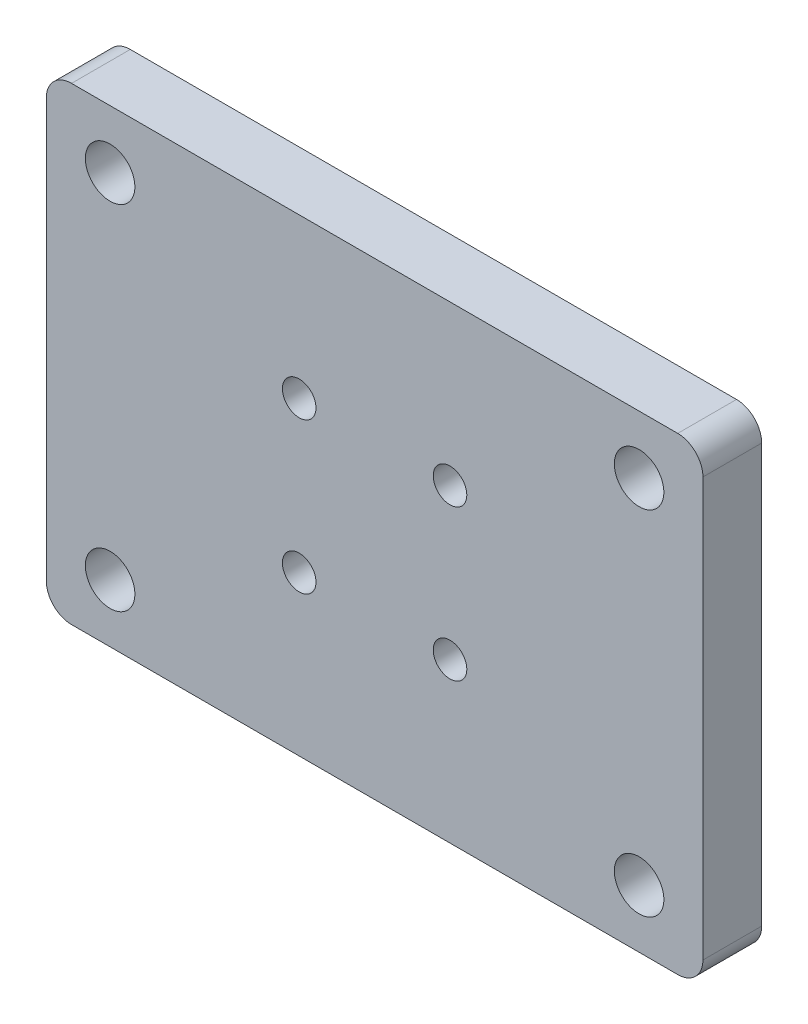
ISO-10303-21;
HEADER;
FILE_DESCRIPTION(('STEP AP214'),'2;1');
FILE_NAME('part.step','',(''),(''),'','','');
FILE_SCHEMA(('AUTOMOTIVE_DESIGN { 1 0 10303 214 1 1 1 1 }'));
ENDSEC;
DATA;
#1=APPLICATION_CONTEXT('core data for automotive mechanical design processes');
#2=APPLICATION_PROTOCOL_DEFINITION('international standard','automotive_design',2000,#1);
#3=PRODUCT_CONTEXT('',#1,'mechanical');
#4=PRODUCT('Part','Part','',(#3));
#5=PRODUCT_RELATED_PRODUCT_CATEGORY('part','',(#4));
#6=PRODUCT_DEFINITION_FORMATION('','',#4);
#7=PRODUCT_DEFINITION_CONTEXT('part definition',#1,'design');
#8=PRODUCT_DEFINITION('design','',#6,#7);
#9=PRODUCT_DEFINITION_SHAPE('','',#8);
#10=(LENGTH_UNIT() NAMED_UNIT(*) SI_UNIT(.MILLI.,.METRE.));
#11=(NAMED_UNIT(*) PLANE_ANGLE_UNIT() SI_UNIT($,.RADIAN.));
#12=(NAMED_UNIT(*) SI_UNIT($,.STERADIAN.) SOLID_ANGLE_UNIT());
#13=UNCERTAINTY_MEASURE_WITH_UNIT(LENGTH_MEASURE(1.E-05),#10,'distance_accuracy_value','');
#14=(GEOMETRIC_REPRESENTATION_CONTEXT(3) GLOBAL_UNCERTAINTY_ASSIGNED_CONTEXT((#13)) GLOBAL_UNIT_ASSIGNED_CONTEXT((#10,
#11,#12)) REPRESENTATION_CONTEXT('',''));
#15=CARTESIAN_POINT('',(0.,0.,0.));
#16=DIRECTION('',(0.,0.,1.));
#17=DIRECTION('',(1.,0.,0.));
#18=AXIS2_PLACEMENT_3D('',#15,#16,#17);
#19=CARTESIAN_POINT('',(8.98025612106915,-8.98025612106936,7.));
#20=DIRECTION('',(0.,0.,1.));
#21=DIRECTION('',(1.,0.,0.));
#22=AXIS2_PLACEMENT_3D('',#19,#20,#21);
#23=CYLINDRICAL_SURFACE('',#22,2.);
#24=CARTESIAN_POINT('',(8.98025612106915,-8.98025612106936,7.));
#25=DIRECTION('',(0.,0.,1.));
#26=DIRECTION('',(1.,0.,0.));
#27=AXIS2_PLACEMENT_3D('',#24,#25,#26);
#28=CIRCLE('',#27,2.);
#29=CARTESIAN_POINT('',(10.9802561210692,-8.98025612106936,7.));
#30=VERTEX_POINT('',#29);
#31=EDGE_CURVE('E197',#30,#30,#28,.T.);
#32=ORIENTED_EDGE('',*,*,#31,.T.);
#33=EDGE_LOOP('',(#32));
#34=FACE_BOUND('',#33,.T.);
#35=CARTESIAN_POINT('',(8.98025612106915,-8.98025612106936,2.));
#36=DIRECTION('',(0.,0.,-1.));
#37=DIRECTION('',(-1.,0.,0.));
#38=AXIS2_PLACEMENT_3D('',#35,#36,#37);
#39=CIRCLE('',#38,2.);
#40=CARTESIAN_POINT('',(6.98025612106915,-8.98025612106936,2.));
#41=VERTEX_POINT('',#40);
#42=EDGE_CURVE('E222',#41,#41,#39,.F.);
#43=ORIENTED_EDGE('',*,*,#42,.F.);
#44=EDGE_LOOP('',(#43));
#45=FACE_BOUND('',#44,.T.);
#46=ADVANCED_FACE('F39',(#34,#45),#23,.F.);
#47=CARTESIAN_POINT('',(-8.98025612106936,-8.98025612106915,7.));
#48=DIRECTION('',(0.,0.,1.));
#49=DIRECTION('',(1.,0.,0.));
#50=AXIS2_PLACEMENT_3D('',#47,#48,#49);
#51=CYLINDRICAL_SURFACE('',#50,2.);
#52=CARTESIAN_POINT('',(-8.98025612106936,-8.98025612106915,7.));
#53=DIRECTION('',(0.,0.,1.));
#54=DIRECTION('',(1.,0.,0.));
#55=AXIS2_PLACEMENT_3D('',#52,#53,#54);
#56=CIRCLE('',#55,2.);
#57=CARTESIAN_POINT('',(-6.98025612106936,-8.98025612106915,7.));
#58=VERTEX_POINT('',#57);
#59=EDGE_CURVE('E213',#58,#58,#56,.T.);
#60=ORIENTED_EDGE('',*,*,#59,.T.);
#61=EDGE_LOOP('',(#60));
#62=FACE_BOUND('',#61,.T.);
#63=CARTESIAN_POINT('',(-8.98025612106936,-8.98025612106915,2.));
#64=DIRECTION('',(0.,0.,-1.));
#65=DIRECTION('',(-1.,0.,0.));
#66=AXIS2_PLACEMENT_3D('',#63,#64,#65);
#67=CIRCLE('',#66,2.);
#68=CARTESIAN_POINT('',(-10.9802561210694,-8.98025612106915,2.));
#69=VERTEX_POINT('',#68);
#70=EDGE_CURVE('E225',#69,#69,#67,.F.);
#71=ORIENTED_EDGE('',*,*,#70,.F.);
#72=EDGE_LOOP('',(#71));
#73=FACE_BOUND('',#72,.T.);
#74=ADVANCED_FACE('F255',(#62,#73),#51,.F.);
#75=CARTESIAN_POINT('',(-8.98025612106915,8.98025612106936,7.));
#76=DIRECTION('',(0.,0.,1.));
#77=DIRECTION('',(1.,0.,0.));
#78=AXIS2_PLACEMENT_3D('',#75,#76,#77);
#79=CYLINDRICAL_SURFACE('',#78,2.);
#80=CARTESIAN_POINT('',(-8.98025612106915,8.98025612106936,7.));
#81=DIRECTION('',(0.,0.,1.));
#82=DIRECTION('',(1.,0.,0.));
#83=AXIS2_PLACEMENT_3D('',#80,#81,#82);
#84=CIRCLE('',#83,2.);
#85=CARTESIAN_POINT('',(-6.98025612106915,8.98025612106936,7.));
#86=VERTEX_POINT('',#85);
#87=EDGE_CURVE('E216',#86,#86,#84,.T.);
#88=ORIENTED_EDGE('',*,*,#87,.T.);
#89=EDGE_LOOP('',(#88));
#90=FACE_BOUND('',#89,.T.);
#91=CARTESIAN_POINT('',(-8.98025612106915,8.98025612106936,2.));
#92=DIRECTION('',(0.,0.,-1.));
#93=DIRECTION('',(-1.,0.,0.));
#94=AXIS2_PLACEMENT_3D('',#91,#92,#93);
#95=CIRCLE('',#94,2.);
#96=CARTESIAN_POINT('',(-10.9802561210692,8.98025612106936,2.));
#97=VERTEX_POINT('',#96);
#98=EDGE_CURVE('E228',#97,#97,#95,.F.);
#99=ORIENTED_EDGE('',*,*,#98,.F.);
#100=EDGE_LOOP('',(#99));
#101=FACE_BOUND('',#100,.T.);
#102=ADVANCED_FACE('F246',(#90,#101),#79,.F.);
#103=CARTESIAN_POINT('',(8.98025612106936,8.98025612106915,7.));
#104=DIRECTION('',(0.,0.,1.));
#105=DIRECTION('',(1.,0.,0.));
#106=AXIS2_PLACEMENT_3D('',#103,#104,#105);
#107=CYLINDRICAL_SURFACE('',#106,2.);
#108=CARTESIAN_POINT('',(8.98025612106936,8.98025612106915,7.));
#109=DIRECTION('',(0.,0.,1.));
#110=DIRECTION('',(1.,0.,0.));
#111=AXIS2_PLACEMENT_3D('',#108,#109,#110);
#112=CIRCLE('',#111,2.);
#113=CARTESIAN_POINT('',(10.9802561210694,8.98025612106915,7.));
#114=VERTEX_POINT('',#113);
#115=EDGE_CURVE('E219',#114,#114,#112,.T.);
#116=ORIENTED_EDGE('',*,*,#115,.T.);
#117=EDGE_LOOP('',(#116));
#118=FACE_BOUND('',#117,.T.);
#119=CARTESIAN_POINT('',(8.98025612106936,8.98025612106915,2.));
#120=DIRECTION('',(0.,0.,-1.));
#121=DIRECTION('',(-1.,0.,0.));
#122=AXIS2_PLACEMENT_3D('',#119,#120,#121);
#123=CIRCLE('',#122,2.);
#124=CARTESIAN_POINT('',(6.98025612106936,8.98025612106915,2.));
#125=VERTEX_POINT('',#124);
#126=EDGE_CURVE('E43',#125,#125,#123,.F.);
#127=ORIENTED_EDGE('',*,*,#126,.F.);
#128=EDGE_LOOP('',(#127));
#129=FACE_BOUND('',#128,.T.);
#130=ADVANCED_FACE('F244',(#118,#129),#107,.F.);
#131=CARTESIAN_POINT('',(-36.1,-24.91,0.));
#132=DIRECTION('',(0.,0.,-1.));
#133=DIRECTION('',(-1.,0.,0.));
#134=AXIS2_PLACEMENT_3D('',#131,#132,#133);
#135=PLANE('',#134);
#136=CARTESIAN_POINT('',(0.,0.,0.));
#137=DIRECTION('',(0.,0.,-1.));
#138=DIRECTION('',(-1.,0.,0.));
#139=AXIS2_PLACEMENT_3D('',#136,#137,#138);
#140=CIRCLE('',#139,20.5);
#141=CARTESIAN_POINT('',(-20.5,0.,0.));
#142=VERTEX_POINT('',#141);
#143=EDGE_CURVE('E231',#142,#142,#140,.T.);
#144=ORIENTED_EDGE('',*,*,#143,.F.);
#145=EDGE_LOOP('',(#144));
#146=FACE_BOUND('',#145,.T.);
#147=CARTESIAN_POINT('',(-36.1,-24.91,0.));
#148=DIRECTION('',(0.,0.,1.));
#149=DIRECTION('',(-1.,0.,0.));
#150=AXIS2_PLACEMENT_3D('',#147,#148,#149);
#151=CIRCLE('',#150,3.);
#152=CARTESIAN_POINT('',(-39.1,-24.91,0.));
#153=VERTEX_POINT('',#152);
#154=CARTESIAN_POINT('',(-36.1,-27.91,0.));
#155=VERTEX_POINT('',#154);
#156=EDGE_CURVE('E137',#153,#155,#151,.T.);
#157=ORIENTED_EDGE('',*,*,#156,.F.);
#158=DIRECTION('',(0.,-1.,0.));
#159=VECTOR('',#158,1.);
#160=CARTESIAN_POINT('',(-39.1,24.91,0.));
#161=LINE('',#160,#159);
#162=CARTESIAN_POINT('',(-39.1,24.91,0.));
#163=VERTEX_POINT('',#162);
#164=EDGE_CURVE('E92',#163,#153,#161,.T.);
#165=ORIENTED_EDGE('',*,*,#164,.F.);
#166=CARTESIAN_POINT('',(-36.1,24.91,0.));
#167=DIRECTION('',(0.,0.,1.));
#168=DIRECTION('',(1.,0.,0.));
#169=AXIS2_PLACEMENT_3D('',#166,#167,#168);
#170=CIRCLE('',#169,3.);
#171=CARTESIAN_POINT('',(-36.1,27.91,0.));
#172=VERTEX_POINT('',#171);
#173=EDGE_CURVE('E86',#172,#163,#170,.T.);
#174=ORIENTED_EDGE('',*,*,#173,.F.);
#175=DIRECTION('',(-1.,0.,0.));
#176=VECTOR('',#175,1.);
#177=CARTESIAN_POINT('',(-36.1,27.91,0.));
#178=LINE('',#177,#176);
#179=CARTESIAN_POINT('',(36.1,27.91,0.));
#180=VERTEX_POINT('',#179);
#181=EDGE_CURVE('E127',#180,#172,#178,.T.);
#182=ORIENTED_EDGE('',*,*,#181,.F.);
#183=CARTESIAN_POINT('',(36.1,24.91,0.));
#184=DIRECTION('',(0.,0.,1.));
#185=DIRECTION('',(1.,0.,0.));
#186=AXIS2_PLACEMENT_3D('',#183,#184,#185);
#187=CIRCLE('',#186,3.);
#188=CARTESIAN_POINT('',(39.1,24.91,0.));
#189=VERTEX_POINT('',#188);
#190=EDGE_CURVE('E147',#189,#180,#187,.T.);
#191=ORIENTED_EDGE('',*,*,#190,.F.);
#192=DIRECTION('',(0.,1.,0.));
#193=VECTOR('',#192,1.);
#194=CARTESIAN_POINT('',(39.1,24.91,0.));
#195=LINE('',#194,#193);
#196=CARTESIAN_POINT('',(39.1,-24.91,0.));
#197=VERTEX_POINT('',#196);
#198=EDGE_CURVE('E145',#197,#189,#195,.T.);
#199=ORIENTED_EDGE('',*,*,#198,.F.);
#200=CARTESIAN_POINT('',(36.1,-24.91,0.));
#201=DIRECTION('',(0.,0.,1.));
#202=DIRECTION('',(-1.,0.,0.));
#203=AXIS2_PLACEMENT_3D('',#200,#201,#202);
#204=CIRCLE('',#203,3.);
#205=CARTESIAN_POINT('',(36.1,-27.91,0.));
#206=VERTEX_POINT('',#205);
#207=EDGE_CURVE('E143',#206,#197,#204,.T.);
#208=ORIENTED_EDGE('',*,*,#207,.F.);
#209=DIRECTION('',(1.,0.,0.));
#210=VECTOR('',#209,1.);
#211=CARTESIAN_POINT('',(-36.1,-27.91,0.));
#212=LINE('',#211,#210);
#213=EDGE_CURVE('E140',#155,#206,#212,.T.);
#214=ORIENTED_EDGE('',*,*,#213,.F.);
#215=EDGE_LOOP('',(#157,#165,#174,#182,#191,#199,#208,#214));
#216=FACE_BOUND('',#215,.T.);
#217=CARTESIAN_POINT('',(31.5,21.,0.));
#218=DIRECTION('',(0.,0.,1.));
#219=DIRECTION('',(1.,0.,0.));
#220=AXIS2_PLACEMENT_3D('',#217,#218,#219);
#221=CIRCLE('',#220,2.95);
#222=CARTESIAN_POINT('',(34.45,21.,0.));
#223=VERTEX_POINT('',#222);
#224=EDGE_CURVE('E187',#223,#223,#221,.T.);
#225=ORIENTED_EDGE('',*,*,#224,.T.);
#226=EDGE_LOOP('',(#225));
#227=FACE_BOUND('',#226,.T.);
#228=CARTESIAN_POINT('',(-31.5,21.,0.));
#229=DIRECTION('',(0.,0.,1.));
#230=DIRECTION('',(1.,0.,0.));
#231=AXIS2_PLACEMENT_3D('',#228,#229,#230);
#232=CIRCLE('',#231,2.95);
#233=CARTESIAN_POINT('',(-28.55,21.,0.));
#234=VERTEX_POINT('',#233);
#235=EDGE_CURVE('E206',#234,#234,#232,.T.);
#236=ORIENTED_EDGE('',*,*,#235,.T.);
#237=EDGE_LOOP('',(#236));
#238=FACE_BOUND('',#237,.T.);
#239=CARTESIAN_POINT('',(-31.5,-21.,0.));
#240=DIRECTION('',(0.,0.,1.));
#241=DIRECTION('',(1.,0.,0.));
#242=AXIS2_PLACEMENT_3D('',#239,#240,#241);
#243=CIRCLE('',#242,2.95);
#244=CARTESIAN_POINT('',(-28.55,-21.,0.));
#245=VERTEX_POINT('',#244);
#246=EDGE_CURVE('E200',#245,#245,#243,.T.);
#247=ORIENTED_EDGE('',*,*,#246,.T.);
#248=EDGE_LOOP('',(#247));
#249=FACE_BOUND('',#248,.T.);
#250=CARTESIAN_POINT('',(31.5,-21.,0.));
#251=DIRECTION('',(0.,0.,1.));
#252=DIRECTION('',(1.,0.,0.));
#253=AXIS2_PLACEMENT_3D('',#250,#251,#252);
#254=CIRCLE('',#253,2.95);
#255=CARTESIAN_POINT('',(34.45,-21.,0.));
#256=VERTEX_POINT('',#255);
#257=EDGE_CURVE('E193',#256,#256,#254,.T.);
#258=ORIENTED_EDGE('',*,*,#257,.T.);
#259=EDGE_LOOP('',(#258));
#260=FACE_BOUND('',#259,.T.);
#261=ADVANCED_FACE('F172',(#146,#216,#227,#238,#249,#260),#135,.T.);
#262=CARTESIAN_POINT('',(-36.1,-24.91,7.));
#263=DIRECTION('',(0.,0.,-1.));
#264=DIRECTION('',(-1.,0.,0.));
#265=AXIS2_PLACEMENT_3D('',#262,#263,#264);
#266=CYLINDRICAL_SURFACE('',#265,3.);
#267=ORIENTED_EDGE('',*,*,#156,.T.);
#268=DIRECTION('',(0.,0.,-1.));
#269=VECTOR('',#268,1.);
#270=CARTESIAN_POINT('',(-36.1,-27.91,7.));
#271=LINE('',#270,#269);
#272=CARTESIAN_POINT('',(-36.1,-27.91,7.));
#273=VERTEX_POINT('',#272);
#274=EDGE_CURVE('E11',#273,#155,#271,.T.);
#275=ORIENTED_EDGE('',*,*,#274,.F.);
#276=CARTESIAN_POINT('',(-36.1,-24.91,7.));
#277=DIRECTION('',(0.,0.,1.));
#278=DIRECTION('',(-1.,0.,0.));
#279=AXIS2_PLACEMENT_3D('',#276,#277,#278);
#280=CIRCLE('',#279,3.);
#281=CARTESIAN_POINT('',(-39.1,-24.91,7.));
#282=VERTEX_POINT('',#281);
#283=EDGE_CURVE('E152',#282,#273,#280,.T.);
#284=ORIENTED_EDGE('',*,*,#283,.F.);
#285=DIRECTION('',(0.,0.,-1.));
#286=VECTOR('',#285,1.);
#287=CARTESIAN_POINT('',(-39.1,-24.91,7.));
#288=LINE('',#287,#286);
#289=EDGE_CURVE('E133',#282,#153,#288,.T.);
#290=ORIENTED_EDGE('',*,*,#289,.T.);
#291=EDGE_LOOP('',(#267,#275,#284,#290));
#292=FACE_BOUND('',#291,.T.);
#293=ADVANCED_FACE('F41',(#292),#266,.T.);
#294=CARTESIAN_POINT('',(-36.1,-27.91,7.));
#295=DIRECTION('',(0.,1.,0.));
#296=DIRECTION('',(0.,0.,1.));
#297=AXIS2_PLACEMENT_3D('',#294,#295,#296);
#298=PLANE('',#297);
#299=ORIENTED_EDGE('',*,*,#213,.T.);
#300=DIRECTION('',(0.,0.,-1.));
#301=VECTOR('',#300,1.);
#302=CARTESIAN_POINT('',(36.1,-27.91,7.));
#303=LINE('',#302,#301);
#304=CARTESIAN_POINT('',(36.1,-27.91,7.));
#305=VERTEX_POINT('',#304);
#306=EDGE_CURVE('E49',#305,#206,#303,.T.);
#307=ORIENTED_EDGE('',*,*,#306,.F.);
#308=DIRECTION('',(1.,0.,0.));
#309=VECTOR('',#308,1.);
#310=CARTESIAN_POINT('',(-36.1,-27.91,7.));
#311=LINE('',#310,#309);
#312=EDGE_CURVE('E100',#273,#305,#311,.T.);
#313=ORIENTED_EDGE('',*,*,#312,.F.);
#314=ORIENTED_EDGE('',*,*,#274,.T.);
#315=EDGE_LOOP('',(#299,#307,#313,#314));
#316=FACE_BOUND('',#315,.T.);
#317=ADVANCED_FACE('F300',(#316),#298,.F.);
#318=CARTESIAN_POINT('',(36.1,-24.91,7.));
#319=DIRECTION('',(0.,0.,-1.));
#320=DIRECTION('',(-1.,0.,0.));
#321=AXIS2_PLACEMENT_3D('',#318,#319,#320);
#322=CYLINDRICAL_SURFACE('',#321,3.);
#323=ORIENTED_EDGE('',*,*,#207,.T.);
#324=DIRECTION('',(0.,0.,-1.));
#325=VECTOR('',#324,1.);
#326=CARTESIAN_POINT('',(39.1,-24.91,7.));
#327=LINE('',#326,#325);
#328=CARTESIAN_POINT('',(39.1,-24.91,7.));
#329=VERTEX_POINT('',#328);
#330=EDGE_CURVE('E159',#329,#197,#327,.T.);
#331=ORIENTED_EDGE('',*,*,#330,.F.);
#332=CARTESIAN_POINT('',(36.1,-24.91,7.));
#333=DIRECTION('',(0.,0.,1.));
#334=DIRECTION('',(-1.,0.,0.));
#335=AXIS2_PLACEMENT_3D('',#332,#333,#334);
#336=CIRCLE('',#335,3.);
#337=EDGE_CURVE('E168',#305,#329,#336,.T.);
#338=ORIENTED_EDGE('',*,*,#337,.F.);
#339=ORIENTED_EDGE('',*,*,#306,.T.);
#340=EDGE_LOOP('',(#323,#331,#338,#339));
#341=FACE_BOUND('',#340,.T.);
#342=ADVANCED_FACE('F166',(#341),#322,.T.);
#343=CARTESIAN_POINT('',(39.1,24.91,7.));
#344=DIRECTION('',(-1.,0.,0.));
#345=DIRECTION('',(0.,0.,1.));
#346=AXIS2_PLACEMENT_3D('',#343,#344,#345);
#347=PLANE('',#346);
#348=ORIENTED_EDGE('',*,*,#198,.T.);
#349=DIRECTION('',(0.,0.,-1.));
#350=VECTOR('',#349,1.);
#351=CARTESIAN_POINT('',(39.1,24.91,7.));
#352=LINE('',#351,#350);
#353=CARTESIAN_POINT('',(39.1,24.91,7.));
#354=VERTEX_POINT('',#353);
#355=EDGE_CURVE('E156',#354,#189,#352,.T.);
#356=ORIENTED_EDGE('',*,*,#355,.F.);
#357=DIRECTION('',(0.,1.,0.));
#358=VECTOR('',#357,1.);
#359=CARTESIAN_POINT('',(39.1,24.91,7.));
#360=LINE('',#359,#358);
#361=EDGE_CURVE('E181',#329,#354,#360,.T.);
#362=ORIENTED_EDGE('',*,*,#361,.F.);
#363=ORIENTED_EDGE('',*,*,#330,.T.);
#364=EDGE_LOOP('',(#348,#356,#362,#363));
#365=FACE_BOUND('',#364,.T.);
#366=ADVANCED_FACE('F177',(#365),#347,.F.);
#367=CARTESIAN_POINT('',(36.1,24.91,7.));
#368=DIRECTION('',(0.,0.,-1.));
#369=DIRECTION('',(-1.,0.,0.));
#370=AXIS2_PLACEMENT_3D('',#367,#368,#369);
#371=CYLINDRICAL_SURFACE('',#370,3.);
#372=ORIENTED_EDGE('',*,*,#190,.T.);
#373=DIRECTION('',(0.,0.,-1.));
#374=VECTOR('',#373,1.);
#375=CARTESIAN_POINT('',(36.1,27.91,7.));
#376=LINE('',#375,#374);
#377=CARTESIAN_POINT('',(36.1,27.91,7.));
#378=VERTEX_POINT('',#377);
#379=EDGE_CURVE('E128',#378,#180,#376,.T.);
#380=ORIENTED_EDGE('',*,*,#379,.F.);
#381=CARTESIAN_POINT('',(36.1,24.91,7.));
#382=DIRECTION('',(0.,0.,1.));
#383=DIRECTION('',(1.,0.,0.));
#384=AXIS2_PLACEMENT_3D('',#381,#382,#383);
#385=CIRCLE('',#384,3.);
#386=EDGE_CURVE('E119',#354,#378,#385,.T.);
#387=ORIENTED_EDGE('',*,*,#386,.F.);
#388=ORIENTED_EDGE('',*,*,#355,.T.);
#389=EDGE_LOOP('',(#372,#380,#387,#388));
#390=FACE_BOUND('',#389,.T.);
#391=ADVANCED_FACE('F180',(#390),#371,.T.);
#392=CARTESIAN_POINT('',(-36.1,27.91,7.));
#393=DIRECTION('',(0.,-1.,0.));
#394=DIRECTION('',(1.,0.,0.));
#395=AXIS2_PLACEMENT_3D('',#392,#393,#394);
#396=PLANE('',#395);
#397=ORIENTED_EDGE('',*,*,#181,.T.);
#398=DIRECTION('',(0.,0.,-1.));
#399=VECTOR('',#398,1.);
#400=CARTESIAN_POINT('',(-36.1,27.91,7.));
#401=LINE('',#400,#399);
#402=CARTESIAN_POINT('',(-36.1,27.91,7.));
#403=VERTEX_POINT('',#402);
#404=EDGE_CURVE('E124',#403,#172,#401,.T.);
#405=ORIENTED_EDGE('',*,*,#404,.F.);
#406=DIRECTION('',(-1.,0.,0.));
#407=VECTOR('',#406,1.);
#408=CARTESIAN_POINT('',(-36.1,27.91,7.));
#409=LINE('',#408,#407);
#410=EDGE_CURVE('E113',#378,#403,#409,.T.);
#411=ORIENTED_EDGE('',*,*,#410,.F.);
#412=ORIENTED_EDGE('',*,*,#379,.T.);
#413=EDGE_LOOP('',(#397,#405,#411,#412));
#414=FACE_BOUND('',#413,.T.);
#415=ADVANCED_FACE('F125',(#414),#396,.F.);
#416=CARTESIAN_POINT('',(-36.1,24.91,7.));
#417=DIRECTION('',(0.,0.,-1.));
#418=DIRECTION('',(-1.,0.,0.));
#419=AXIS2_PLACEMENT_3D('',#416,#417,#418);
#420=CYLINDRICAL_SURFACE('',#419,3.);
#421=ORIENTED_EDGE('',*,*,#173,.T.);
#422=DIRECTION('',(0.,0.,-1.));
#423=VECTOR('',#422,1.);
#424=CARTESIAN_POINT('',(-39.1,24.91,7.));
#425=LINE('',#424,#423);
#426=CARTESIAN_POINT('',(-39.1,24.91,7.));
#427=VERTEX_POINT('',#426);
#428=EDGE_CURVE('E129',#427,#163,#425,.T.);
#429=ORIENTED_EDGE('',*,*,#428,.F.);
#430=CARTESIAN_POINT('',(-36.1,24.91,7.));
#431=DIRECTION('',(0.,0.,1.));
#432=DIRECTION('',(1.,0.,0.));
#433=AXIS2_PLACEMENT_3D('',#430,#431,#432);
#434=CIRCLE('',#433,3.);
#435=EDGE_CURVE('E117',#403,#427,#434,.T.);
#436=ORIENTED_EDGE('',*,*,#435,.F.);
#437=ORIENTED_EDGE('',*,*,#404,.T.);
#438=EDGE_LOOP('',(#421,#429,#436,#437));
#439=FACE_BOUND('',#438,.T.);
#440=ADVANCED_FACE('F131',(#439),#420,.T.);
#441=CARTESIAN_POINT('',(-39.1,24.91,7.));
#442=DIRECTION('',(1.,0.,0.));
#443=DIRECTION('',(0.,0.,-1.));
#444=AXIS2_PLACEMENT_3D('',#441,#442,#443);
#445=PLANE('',#444);
#446=ORIENTED_EDGE('',*,*,#164,.T.);
#447=ORIENTED_EDGE('',*,*,#289,.F.);
#448=DIRECTION('',(0.,-1.,0.));
#449=VECTOR('',#448,1.);
#450=CARTESIAN_POINT('',(-39.1,24.91,7.));
#451=LINE('',#450,#449);
#452=EDGE_CURVE('E57',#427,#282,#451,.T.);
#453=ORIENTED_EDGE('',*,*,#452,.F.);
#454=ORIENTED_EDGE('',*,*,#428,.T.);
#455=EDGE_LOOP('',(#446,#447,#453,#454));
#456=FACE_BOUND('',#455,.T.);
#457=ADVANCED_FACE('F286',(#456),#445,.F.);
#458=CARTESIAN_POINT('',(-36.1,-24.91,7.));
#459=DIRECTION('',(0.,0.,-1.));
#460=DIRECTION('',(-1.,0.,0.));
#461=AXIS2_PLACEMENT_3D('',#458,#459,#460);
#462=PLANE('',#461);
#463=ORIENTED_EDGE('',*,*,#115,.F.);
#464=EDGE_LOOP('',(#463));
#465=FACE_BOUND('',#464,.T.);
#466=ORIENTED_EDGE('',*,*,#87,.F.);
#467=EDGE_LOOP('',(#466));
#468=FACE_BOUND('',#467,.T.);
#469=ORIENTED_EDGE('',*,*,#59,.F.);
#470=EDGE_LOOP('',(#469));
#471=FACE_BOUND('',#470,.T.);
#472=ORIENTED_EDGE('',*,*,#31,.F.);
#473=EDGE_LOOP('',(#472));
#474=FACE_BOUND('',#473,.T.);
#475=CARTESIAN_POINT('',(31.5,-21.,7.));
#476=DIRECTION('',(0.,0.,1.));
#477=DIRECTION('',(1.,0.,0.));
#478=AXIS2_PLACEMENT_3D('',#475,#476,#477);
#479=CIRCLE('',#478,2.95);
#480=CARTESIAN_POINT('',(34.45,-21.,7.));
#481=VERTEX_POINT('',#480);
#482=EDGE_CURVE('E196',#481,#481,#479,.T.);
#483=ORIENTED_EDGE('',*,*,#482,.F.);
#484=EDGE_LOOP('',(#483));
#485=FACE_BOUND('',#484,.T.);
#486=CARTESIAN_POINT('',(-31.5,-21.,7.));
#487=DIRECTION('',(0.,0.,1.));
#488=DIRECTION('',(1.,0.,0.));
#489=AXIS2_PLACEMENT_3D('',#486,#487,#488);
#490=CIRCLE('',#489,2.95);
#491=CARTESIAN_POINT('',(-28.55,-21.,7.));
#492=VERTEX_POINT('',#491);
#493=EDGE_CURVE('E203',#492,#492,#490,.T.);
#494=ORIENTED_EDGE('',*,*,#493,.F.);
#495=EDGE_LOOP('',(#494));
#496=FACE_BOUND('',#495,.T.);
#497=CARTESIAN_POINT('',(-31.5,21.,7.));
#498=DIRECTION('',(0.,0.,1.));
#499=DIRECTION('',(1.,0.,0.));
#500=AXIS2_PLACEMENT_3D('',#497,#498,#499);
#501=CIRCLE('',#500,2.95);
#502=CARTESIAN_POINT('',(-28.55,21.,7.));
#503=VERTEX_POINT('',#502);
#504=EDGE_CURVE('E190',#503,#503,#501,.T.);
#505=ORIENTED_EDGE('',*,*,#504,.F.);
#506=EDGE_LOOP('',(#505));
#507=FACE_BOUND('',#506,.T.);
#508=CARTESIAN_POINT('',(31.5,21.,7.));
#509=DIRECTION('',(0.,0.,1.));
#510=DIRECTION('',(1.,0.,0.));
#511=AXIS2_PLACEMENT_3D('',#508,#509,#510);
#512=CIRCLE('',#511,2.95);
#513=CARTESIAN_POINT('',(34.45,21.,7.));
#514=VERTEX_POINT('',#513);
#515=EDGE_CURVE('E141',#514,#514,#512,.T.);
#516=ORIENTED_EDGE('',*,*,#515,.F.);
#517=EDGE_LOOP('',(#516));
#518=FACE_BOUND('',#517,.T.);
#519=ORIENTED_EDGE('',*,*,#283,.T.);
#520=ORIENTED_EDGE('',*,*,#312,.T.);
#521=ORIENTED_EDGE('',*,*,#337,.T.);
#522=ORIENTED_EDGE('',*,*,#361,.T.);
#523=ORIENTED_EDGE('',*,*,#386,.T.);
#524=ORIENTED_EDGE('',*,*,#410,.T.);
#525=ORIENTED_EDGE('',*,*,#435,.T.);
#526=ORIENTED_EDGE('',*,*,#452,.T.);
#527=EDGE_LOOP('',(#519,#520,#521,#522,#523,#524,#525,#526));
#528=FACE_BOUND('',#527,.T.);
#529=ADVANCED_FACE('F115',(#465,#468,#471,#474,#485,#496,#507,#518,#528),#462,.F.);
#530=CARTESIAN_POINT('',(31.5,21.,7.));
#531=DIRECTION('',(0.,0.,-1.));
#532=DIRECTION('',(-1.,0.,0.));
#533=AXIS2_PLACEMENT_3D('',#530,#531,#532);
#534=CYLINDRICAL_SURFACE('',#533,2.95);
#535=ORIENTED_EDGE('',*,*,#515,.T.);
#536=EDGE_LOOP('',(#535));
#537=FACE_BOUND('',#536,.T.);
#538=ORIENTED_EDGE('',*,*,#224,.F.);
#539=EDGE_LOOP('',(#538));
#540=FACE_BOUND('',#539,.T.);
#541=ADVANCED_FACE('F274',(#537,#540),#534,.F.);
#542=CARTESIAN_POINT('',(-31.5,21.,7.));
#543=DIRECTION('',(0.,0.,-1.));
#544=DIRECTION('',(-1.,0.,0.));
#545=AXIS2_PLACEMENT_3D('',#542,#543,#544);
#546=CYLINDRICAL_SURFACE('',#545,2.95);
#547=ORIENTED_EDGE('',*,*,#504,.T.);
#548=EDGE_LOOP('',(#547));
#549=FACE_BOUND('',#548,.T.);
#550=ORIENTED_EDGE('',*,*,#235,.F.);
#551=EDGE_LOOP('',(#550));
#552=FACE_BOUND('',#551,.T.);
#553=ADVANCED_FACE('F270',(#549,#552),#546,.F.);
#554=CARTESIAN_POINT('',(-31.5,-21.,7.));
#555=DIRECTION('',(0.,0.,-1.));
#556=DIRECTION('',(-1.,0.,0.));
#557=AXIS2_PLACEMENT_3D('',#554,#555,#556);
#558=CYLINDRICAL_SURFACE('',#557,2.95);
#559=ORIENTED_EDGE('',*,*,#493,.T.);
#560=EDGE_LOOP('',(#559));
#561=FACE_BOUND('',#560,.T.);
#562=ORIENTED_EDGE('',*,*,#246,.F.);
#563=EDGE_LOOP('',(#562));
#564=FACE_BOUND('',#563,.T.);
#565=ADVANCED_FACE('F273',(#561,#564),#558,.F.);
#566=CARTESIAN_POINT('',(31.5,-21.,7.));
#567=DIRECTION('',(0.,0.,-1.));
#568=DIRECTION('',(-1.,0.,0.));
#569=AXIS2_PLACEMENT_3D('',#566,#567,#568);
#570=CYLINDRICAL_SURFACE('',#569,2.95);
#571=ORIENTED_EDGE('',*,*,#482,.T.);
#572=EDGE_LOOP('',(#571));
#573=FACE_BOUND('',#572,.T.);
#574=ORIENTED_EDGE('',*,*,#257,.F.);
#575=EDGE_LOOP('',(#574));
#576=FACE_BOUND('',#575,.T.);
#577=ADVANCED_FACE('F278',(#573,#576),#570,.F.);
#578=CARTESIAN_POINT('',(0.,0.,2.));
#579=DIRECTION('',(0.,0.,-1.));
#580=DIRECTION('',(-1.,0.,0.));
#581=AXIS2_PLACEMENT_3D('',#578,#579,#580);
#582=PLANE('',#581);
#583=CARTESIAN_POINT('',(0.,0.,2.));
#584=DIRECTION('',(0.,0.,-1.));
#585=DIRECTION('',(-1.,0.,0.));
#586=AXIS2_PLACEMENT_3D('',#583,#584,#585);
#587=CIRCLE('',#586,20.5);
#588=CARTESIAN_POINT('',(-20.5,0.,2.));
#589=VERTEX_POINT('',#588);
#590=EDGE_CURVE('E234',#589,#589,#587,.T.);
#591=ORIENTED_EDGE('',*,*,#590,.T.);
#592=EDGE_LOOP('',(#591));
#593=FACE_BOUND('',#592,.T.);
#594=ORIENTED_EDGE('',*,*,#126,.T.);
#595=EDGE_LOOP('',(#594));
#596=FACE_BOUND('',#595,.T.);
#597=ORIENTED_EDGE('',*,*,#98,.T.);
#598=EDGE_LOOP('',(#597));
#599=FACE_BOUND('',#598,.T.);
#600=ORIENTED_EDGE('',*,*,#70,.T.);
#601=EDGE_LOOP('',(#600));
#602=FACE_BOUND('',#601,.T.);
#603=ORIENTED_EDGE('',*,*,#42,.T.);
#604=EDGE_LOOP('',(#603));
#605=FACE_BOUND('',#604,.T.);
#606=ADVANCED_FACE('F241',(#593,#596,#599,#602,#605),#582,.T.);
#607=CARTESIAN_POINT('',(0.,0.,2.));
#608=DIRECTION('',(0.,0.,-1.));
#609=DIRECTION('',(-1.,0.,0.));
#610=AXIS2_PLACEMENT_3D('',#607,#608,#609);
#611=CYLINDRICAL_SURFACE('',#610,20.5);
#612=ORIENTED_EDGE('',*,*,#590,.F.);
#613=EDGE_LOOP('',(#612));
#614=FACE_BOUND('',#613,.T.);
#615=ORIENTED_EDGE('',*,*,#143,.T.);
#616=EDGE_LOOP('',(#615));
#617=FACE_BOUND('',#616,.T.);
#618=ADVANCED_FACE('F413',(#614,#617),#611,.F.);
#619=CLOSED_SHELL('',(#46,#74,#102,#130,#261,#293,#317,#342,#366,#391,#415,#440,#457,#529,#541,
#553,#565,#577,#606,#618));
#620=MANIFOLD_SOLID_BREP('B2',#619);
#621=ADVANCED_BREP_SHAPE_REPRESENTATION('',(#18,#620),#14);
#622=SHAPE_DEFINITION_REPRESENTATION(#9,#621);
ENDSEC;
END-ISO-10303-21;
